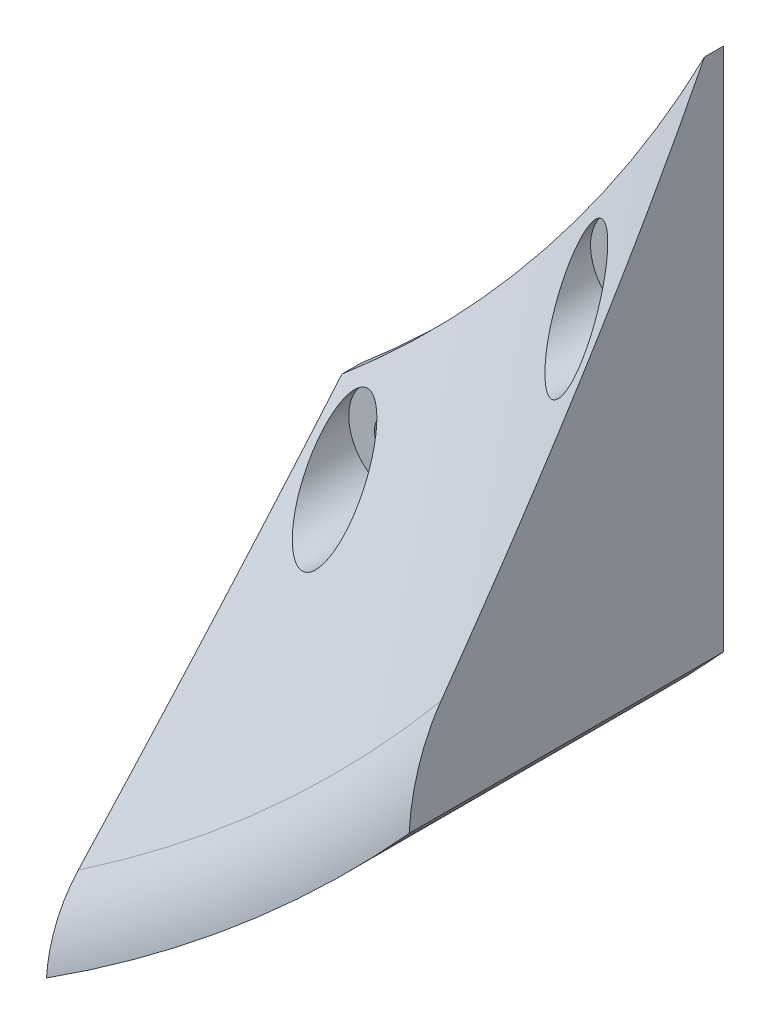
ISO-10303-21;
HEADER;
FILE_DESCRIPTION(('STEP AP214'),'2;1');
FILE_NAME('part.step','',(''),(''),'','','');
FILE_SCHEMA(('AUTOMOTIVE_DESIGN { 1 0 10303 214 1 1 1 1 }'));
ENDSEC;
DATA;
#1=APPLICATION_CONTEXT('core data for automotive mechanical design processes');
#2=APPLICATION_PROTOCOL_DEFINITION('international standard','automotive_design',2000,#1);
#3=PRODUCT_CONTEXT('',#1,'mechanical');
#4=PRODUCT('Part','Part','',(#3));
#5=PRODUCT_RELATED_PRODUCT_CATEGORY('part','',(#4));
#6=PRODUCT_DEFINITION_FORMATION('','',#4);
#7=PRODUCT_DEFINITION_CONTEXT('part definition',#1,'design');
#8=PRODUCT_DEFINITION('design','',#6,#7);
#9=PRODUCT_DEFINITION_SHAPE('','',#8);
#10=(LENGTH_UNIT() NAMED_UNIT(*) SI_UNIT(.MILLI.,.METRE.));
#11=(NAMED_UNIT(*) PLANE_ANGLE_UNIT() SI_UNIT($,.RADIAN.));
#12=(NAMED_UNIT(*) SI_UNIT($,.STERADIAN.) SOLID_ANGLE_UNIT());
#13=UNCERTAINTY_MEASURE_WITH_UNIT(LENGTH_MEASURE(1.E-05),#10,'distance_accuracy_value','');
#14=(GEOMETRIC_REPRESENTATION_CONTEXT(3) GLOBAL_UNCERTAINTY_ASSIGNED_CONTEXT((#13)) GLOBAL_UNIT_ASSIGNED_CONTEXT((#10,
#11,#12)) REPRESENTATION_CONTEXT('',''));
#15=CARTESIAN_POINT('',(0.,0.,0.));
#16=DIRECTION('',(0.,0.,1.));
#17=DIRECTION('',(1.,0.,0.));
#18=AXIS2_PLACEMENT_3D('',#15,#16,#17);
#19=CARTESIAN_POINT('',(0.,0.,3.175));
#20=DIRECTION('',(0.,0.,1.));
#21=DIRECTION('',(1.,0.,0.));
#22=AXIS2_PLACEMENT_3D('',#19,#20,#21);
#23=PLANE('',#22);
#24=CARTESIAN_POINT('',(-205.731089426,0.,3.175));
#25=DIRECTION('',(0.,0.,-1.));
#26=DIRECTION('',(-1.,0.,0.));
#27=AXIS2_PLACEMENT_3D('',#24,#25,#26);
#28=CIRCLE('',#27,190.5);
#29=CARTESIAN_POINT('',(-64.765544713,-128.136510034288,3.175));
#30=VERTEX_POINT('',#29);
#31=CARTESIAN_POINT('',(-102.865544713,-160.340044003043,3.175));
#32=VERTEX_POINT('',#31);
#33=EDGE_CURVE('E175',#30,#32,#28,.T.);
#34=ORIENTED_EDGE('',*,*,#33,.T.);
#35=DIRECTION('',(0.,1.,0.));
#36=VECTOR('',#35,1.);
#37=CARTESIAN_POINT('',(-102.865544713,0.,3.175));
#38=LINE('',#37,#36);
#39=CARTESIAN_POINT('',(-102.865544713,-120.914193587427,3.175));
#40=VERTEX_POINT('',#39);
#41=EDGE_CURVE('E210',#32,#40,#38,.T.);
#42=ORIENTED_EDGE('',*,*,#41,.T.);
#43=CARTESIAN_POINT('',(-205.731089426,0.,3.175));
#44=DIRECTION('',(0.,0.,-1.));
#45=DIRECTION('',(-1.,0.,0.));
#46=AXIS2_PLACEMENT_3D('',#43,#44,#45);
#47=CIRCLE('',#46,158.75);
#48=CARTESIAN_POINT('',(-64.765544713,-73.0087508711607,3.175));
#49=VERTEX_POINT('',#48);
#50=EDGE_CURVE('E116',#49,#40,#47,.T.);
#51=ORIENTED_EDGE('',*,*,#50,.F.);
#52=DIRECTION('',(0.,-1.,0.));
#53=VECTOR('',#52,1.);
#54=CARTESIAN_POINT('',(-64.765544713,0.,3.175));
#55=LINE('',#54,#53);
#56=EDGE_CURVE('E186',#49,#30,#55,.T.);
#57=ORIENTED_EDGE('',*,*,#56,.T.);
#58=EDGE_LOOP('',(#34,#42,#51,#57));
#59=FACE_BOUND('',#58,.T.);
#60=CARTESIAN_POINT('',(-96.5155447130001,-123.814275400871,3.175));
#61=DIRECTION('',(0.,0.,-1.));
#62=DIRECTION('',(-1.,0.,0.));
#63=AXIS2_PLACEMENT_3D('',#60,#61,#62);
#64=CIRCLE('',#63,2.38125);
#65=CARTESIAN_POINT('',(-98.8967947130001,-123.814275400871,3.175));
#66=VERTEX_POINT('',#65);
#67=EDGE_CURVE('E179',#66,#66,#64,.F.);
#68=ORIENTED_EDGE('',*,*,#67,.T.);
#69=EDGE_LOOP('',(#68));
#70=FACE_BOUND('',#69,.T.);
#71=CARTESIAN_POINT('',(-71.115544713,-95.5859044086643,3.175));
#72=DIRECTION('',(0.,0.,-1.));
#73=DIRECTION('',(-1.,0.,0.));
#74=AXIS2_PLACEMENT_3D('',#71,#72,#73);
#75=CIRCLE('',#74,2.38125);
#76=CARTESIAN_POINT('',(-73.4967947130001,-95.5859044086643,3.175));
#77=VERTEX_POINT('',#76);
#78=EDGE_CURVE('E182',#77,#77,#75,.F.);
#79=ORIENTED_EDGE('',*,*,#78,.T.);
#80=EDGE_LOOP('',(#79));
#81=FACE_BOUND('',#80,.T.);
#82=ADVANCED_FACE('F51',(#59,#70,#81),#23,.F.);
#83=CARTESIAN_POINT('',(-64.765544713,0.,3.175));
#84=DIRECTION('',(-1.,0.,0.));
#85=DIRECTION('',(0.,0.,-1.));
#86=AXIS2_PLACEMENT_3D('',#83,#84,#85);
#87=PLANE('',#86);
#88=DIRECTION('',(0.,0.,-1.));
#89=VECTOR('',#88,1.);
#90=CARTESIAN_POINT('',(-64.765544713,-128.136510034288,36.195));
#91=LINE('',#90,#89);
#92=CARTESIAN_POINT('',(-64.765544713,-128.136510034288,36.195));
#93=VERTEX_POINT('',#92);
#94=EDGE_CURVE('E202',#93,#30,#91,.T.);
#95=ORIENTED_EDGE('',*,*,#94,.T.);
#96=ORIENTED_EDGE('',*,*,#56,.F.);
#97=DIRECTION('',(0.,0.,-1.));
#98=VECTOR('',#97,1.);
#99=CARTESIAN_POINT('',(-64.765544713,-73.0087508711607,36.195));
#100=LINE('',#99,#98);
#101=CARTESIAN_POINT('',(-64.765544713,-73.0087508711607,5.16448633567178));
#102=VERTEX_POINT('',#101);
#103=EDGE_CURVE('E191',#102,#49,#100,.T.);
#104=ORIENTED_EDGE('',*,*,#103,.F.);
#105=CARTESIAN_POINT('',(-64.765544713,-122.400454671408,36.195));
#106=CARTESIAN_POINT('',(-64.765544713,-121.416590849687,35.4785968685116));
#107=CARTESIAN_POINT('',(-64.765544713,-120.430388900259,34.76540874244));
#108=CARTESIAN_POINT('',(-64.765544713,-118.453117212918,33.3457993893004));
#109=CARTESIAN_POINT('',(-64.765544713,-117.462047442748,32.6393782071672));
#110=CARTESIAN_POINT('',(-64.765544713,-114.48118501242,30.5307253962073));
#111=CARTESIAN_POINT('',(-64.765544713,-112.483822098221,29.1391649220652));
#112=CARTESIAN_POINT('',(-64.765544713,-108.47048503121,26.3897295277692));
#113=CARTESIAN_POINT('',(-64.765544713,-106.454543729004,25.031806684119));
#114=CARTESIAN_POINT('',(-64.765544713,-102.399473321646,22.3509979809147));
#115=CARTESIAN_POINT('',(-64.765544713,-100.36034425642,21.0281120610459));
#116=CARTESIAN_POINT('',(-64.765544713,-96.2563588364718,18.4208440314967));
#117=CARTESIAN_POINT('',(-64.765544713,-94.1914918681593,17.1364786038629));
#118=CARTESIAN_POINT('',(-64.765544713,-90.0352609181289,14.6114798516549));
#119=CARTESIAN_POINT('',(-64.765544713,-87.9438978934333,13.3708449536465));
#120=CARTESIAN_POINT('',(-64.765544713,-83.7297219329408,10.9366392217588));
#121=CARTESIAN_POINT('',(-64.765544713,-81.6068668523711,9.7431411216564));
#122=CARTESIAN_POINT('',(-64.765544713,-78.3999695866644,7.99408029022117));
#123=CARTESIAN_POINT('',(-64.765544713,-77.3271526736967,7.41788235005025));
#124=CARTESIAN_POINT('',(-64.765544713,-75.1737936033442,6.280052268688));
#125=CARTESIAN_POINT('',(-64.765544713,-74.0932512736997,5.71842045358934));
#126=CARTESIAN_POINT('',(-64.765544713,-73.0087508711607,5.16448633567178));
#127=B_SPLINE_CURVE_WITH_KNOTS('',3,(#105,#106,#107,#108,#109,#110,#111,#112,#113,#114,#115,
#116,#117,#118,#119,#120,#121,#122,#123,#124,#125,#126),.UNSPECIFIED.,.F.,.F.,(4,2,2,2,2,2,2,2,
2,2,4),(0.,3.65115060245099,7.3023254330328,14.6049827275261,21.8965557206125,29.1881161606817,
36.4827900453566,43.7772011975581,51.0824600388428,54.7356424704663,58.3889066156202),.UNSPECIFIED.);
#128=CARTESIAN_POINT('',(-64.765544713,-117.769882618231,32.8601815378473));
#129=VERTEX_POINT('',#128);
#130=EDGE_CURVE('E113',#129,#102,#127,.T.);
#131=ORIENTED_EDGE('',*,*,#130,.F.);
#132=CARTESIAN_POINT('',(-64.765544713,-128.136510034288,36.195));
#133=CARTESIAN_POINT('',(-64.765544713,-127.823580349849,36.1796656996604));
#134=CARTESIAN_POINT('',(-64.765544713,-127.510971987033,36.1578071405204));
#135=CARTESIAN_POINT('',(-64.765544713,-126.886924794625,36.1010465623842));
#136=CARTESIAN_POINT('',(-64.765544713,-126.575486029674,36.0661438328688));
#137=CARTESIAN_POINT('',(-64.765544713,-125.9537996422,35.9832296915999));
#138=CARTESIAN_POINT('',(-64.765544713,-125.643555028566,35.9351956141636));
#139=CARTESIAN_POINT('',(-64.765544713,-125.025416067989,35.8259748325979));
#140=CARTESIAN_POINT('',(-64.765544713,-124.717521692796,35.7647882868191));
#141=CARTESIAN_POINT('',(-64.765544713,-123.814718625966,35.5649447435988));
#142=CARTESIAN_POINT('',(-64.765544713,-123.223773655474,35.4077496997964));
#143=CARTESIAN_POINT('',(-64.765544713,-122.05879493956,35.0414120669158));
#144=CARTESIAN_POINT('',(-64.765544713,-121.48474633384,34.8323167498205));
#145=CARTESIAN_POINT('',(-64.765544713,-120.371871269923,34.3641787371624));
#146=CARTESIAN_POINT('',(-64.765544713,-119.832547293404,34.1063388877265));
#147=CARTESIAN_POINT('',(-64.765544713,-119.043408380623,33.6752720243169));
#148=CARTESIAN_POINT('',(-64.765544713,-118.782022278019,33.5230508447224));
#149=CARTESIAN_POINT('',(-64.765544713,-118.268546544607,33.2032771525242));
#150=CARTESIAN_POINT('',(-64.765544713,-118.016464041156,33.0357132146166));
#151=CARTESIAN_POINT('',(-64.765544713,-117.769882618231,32.8601815378478));
#152=B_SPLINE_CURVE_WITH_KNOTS('',3,(#132,#133,#134,#135,#136,#137,#138,#139,#140,#141,#142,
#143,#144,#145,#146,#147,#148,#149,#150,#151),.UNSPECIFIED.,.F.,.F.,(4,2,2,2,2,2,2,2,2,4),(0.,
0.939843409882723,1.87973802073256,2.82126531601604,3.76278127629976,5.59477906008722,
7.42511430144152,9.21509548376389,10.1220648596623,11.0297152089648),.UNSPECIFIED.);
#153=EDGE_CURVE('E110',#93,#129,#152,.T.);
#154=ORIENTED_EDGE('',*,*,#153,.F.);
#155=EDGE_LOOP('',(#95,#96,#104,#131,#154));
#156=FACE_BOUND('',#155,.T.);
#157=ADVANCED_FACE('F136',(#156),#87,.F.);
#158=CARTESIAN_POINT('',(-71.115544713,-95.5859044086643,0.));
#159=DIRECTION('',(0.,0.,1.));
#160=DIRECTION('',(-1.,0.,0.));
#161=AXIS2_PLACEMENT_3D('',#158,#159,#160);
#162=CYLINDRICAL_SURFACE('',#161,2.38125);
#163=CARTESIAN_POINT('',(-71.115544713,-95.5859044086643,5.715));
#164=DIRECTION('',(0.,0.,1.));
#165=DIRECTION('',(1.,0.,0.));
#166=AXIS2_PLACEMENT_3D('',#163,#164,#165);
#167=CIRCLE('',#166,2.38125);
#168=CARTESIAN_POINT('',(-68.7342947130001,-95.5859044086643,5.715));
#169=VERTEX_POINT('',#168);
#170=EDGE_CURVE('E150',#169,#169,#167,.F.);
#171=ORIENTED_EDGE('',*,*,#170,.F.);
#172=EDGE_LOOP('',(#171));
#173=FACE_BOUND('',#172,.T.);
#174=ORIENTED_EDGE('',*,*,#78,.F.);
#175=EDGE_LOOP('',(#174));
#176=FACE_BOUND('',#175,.T.);
#177=ADVANCED_FACE('F134',(#173,#176),#162,.F.);
#178=CARTESIAN_POINT('',(-96.5155447130001,-123.814275400871,0.));
#179=DIRECTION('',(0.,0.,1.));
#180=DIRECTION('',(-1.,0.,0.));
#181=AXIS2_PLACEMENT_3D('',#178,#179,#180);
#182=CYLINDRICAL_SURFACE('',#181,2.38125);
#183=CARTESIAN_POINT('',(-96.5155447130001,-123.814275400871,5.715));
#184=DIRECTION('',(0.,0.,1.));
#185=DIRECTION('',(1.,0.,0.));
#186=AXIS2_PLACEMENT_3D('',#183,#184,#185);
#187=CIRCLE('',#186,2.38125);
#188=CARTESIAN_POINT('',(-94.1342947130001,-123.814275400871,5.715));
#189=VERTEX_POINT('',#188);
#190=EDGE_CURVE('E198',#189,#189,#187,.F.);
#191=ORIENTED_EDGE('',*,*,#190,.F.);
#192=EDGE_LOOP('',(#191));
#193=FACE_BOUND('',#192,.T.);
#194=ORIENTED_EDGE('',*,*,#67,.F.);
#195=EDGE_LOOP('',(#194));
#196=FACE_BOUND('',#195,.T.);
#197=ADVANCED_FACE('F220',(#193,#196),#182,.F.);
#198=CARTESIAN_POINT('',(-205.731089426,0.,36.195));
#199=DIRECTION('',(0.,0.,-1.));
#200=DIRECTION('',(1.,0.,0.));
#201=AXIS2_PLACEMENT_3D('',#198,#199,#200);
#202=CYLINDRICAL_SURFACE('',#201,190.5);
#203=ORIENTED_EDGE('',*,*,#33,.F.);
#204=ORIENTED_EDGE('',*,*,#94,.F.);
#205=CARTESIAN_POINT('',(-205.731089426,0.,36.195));
#206=DIRECTION('',(0.,0.,-1.));
#207=DIRECTION('',(-1.,0.,0.));
#208=AXIS2_PLACEMENT_3D('',#205,#206,#207);
#209=CIRCLE('',#208,190.5);
#210=CARTESIAN_POINT('',(-102.865544713,-160.340044003043,36.195));
#211=VERTEX_POINT('',#210);
#212=EDGE_CURVE('E189',#93,#211,#209,.T.);
#213=ORIENTED_EDGE('',*,*,#212,.T.);
#214=DIRECTION('',(0.,0.,-1.));
#215=VECTOR('',#214,1.);
#216=CARTESIAN_POINT('',(-102.865544713,-160.340044003043,36.195));
#217=LINE('',#216,#215);
#218=EDGE_CURVE('E105',#211,#32,#217,.T.);
#219=ORIENTED_EDGE('',*,*,#218,.T.);
#220=EDGE_LOOP('',(#203,#204,#213,#219));
#221=FACE_BOUND('',#220,.T.);
#222=ADVANCED_FACE('F142',(#221),#202,.T.);
#223=CARTESIAN_POINT('',(-205.731089426,0.,36.195));
#224=DIRECTION('',(0.,0.,-1.));
#225=DIRECTION('',(1.,0.,0.));
#226=AXIS2_PLACEMENT_3D('',#223,#224,#225);
#227=CYLINDRICAL_SURFACE('',#226,158.75);
#228=ORIENTED_EDGE('',*,*,#103,.T.);
#229=ORIENTED_EDGE('',*,*,#50,.T.);
#230=DIRECTION('',(0.,0.,-1.));
#231=VECTOR('',#230,1.);
#232=CARTESIAN_POINT('',(-102.865544713,-120.914193587427,36.195));
#233=LINE('',#232,#231);
#234=CARTESIAN_POINT('',(-102.865544713,-120.914193587427,5.16448633567178));
#235=VERTEX_POINT('',#234);
#236=EDGE_CURVE('E201',#235,#40,#233,.T.);
#237=ORIENTED_EDGE('',*,*,#236,.F.);
#238=CARTESIAN_POINT('',(-205.731089426,0.,5.16448633567178));
#239=DIRECTION('',(0.,0.,-1.));
#240=DIRECTION('',(-1.,0.,0.));
#241=AXIS2_PLACEMENT_3D('',#238,#239,#240);
#242=CIRCLE('',#241,158.75);
#243=EDGE_CURVE('E77',#102,#235,#242,.T.);
#244=ORIENTED_EDGE('',*,*,#243,.F.);
#245=EDGE_LOOP('',(#228,#229,#237,#244));
#246=FACE_BOUND('',#245,.T.);
#247=ADVANCED_FACE('F214',(#246),#227,.F.);
#248=CARTESIAN_POINT('',(-205.731089426,0.,5.16448633567178));
#249=DIRECTION('',(0.,0.,1.));
#250=DIRECTION('',(-1.,0.,0.));
#251=AXIS2_PLACEMENT_3D('',#248,#249,#250);
#252=CONICAL_SURFACE('',#251,158.75,0.733038285837613);
#253=CARTESIAN_POINT('',(-92.5905024590012,-127.039247230876,17.7887178190615));
#254=CARTESIAN_POINT('',(-92.6546991101273,-127.11738039782,17.8061015104382));
#255=CARTESIAN_POINT('',(-92.7215713357747,-127.194005570302,17.8203561981865));
#256=CARTESIAN_POINT('',(-92.8603306129642,-127.343612167539,17.8423442933654));
#257=CARTESIAN_POINT('',(-92.9322189260877,-127.416592667658,17.8500760537861));
#258=CARTESIAN_POINT('',(-93.0805265969551,-127.558280265856,17.8588567655701));
#259=CARTESIAN_POINT('',(-93.1569475779661,-127.626985814693,17.859903308018));
#260=CARTESIAN_POINT('',(-93.3137284336997,-127.759565749781,17.8552852893378));
#261=CARTESIAN_POINT('',(-93.3940898261815,-127.823438249972,17.8496181224601));
#262=CARTESIAN_POINT('',(-93.5578458627742,-127.945720016927,17.831705659719));
#263=CARTESIAN_POINT('',(-93.6412324454473,-128.004142506699,17.8194767985287));
#264=CARTESIAN_POINT('',(-93.8105599902199,-128.115406180831,17.7886831431106));
#265=CARTESIAN_POINT('',(-93.8965019316025,-128.168245189183,17.770115890508));
#266=CARTESIAN_POINT('',(-94.0702250179814,-128.268133534975,17.7269815073936));
#267=CARTESIAN_POINT('',(-94.1580063002118,-128.315182438599,17.7024139277266));
#268=CARTESIAN_POINT('',(-94.3347631781989,-128.403431732317,17.6476845160489));
#269=CARTESIAN_POINT('',(-94.423739016458,-128.444630914614,17.6175215317062));
#270=CARTESIAN_POINT('',(-94.6241615960391,-128.530596831443,17.5440259651274));
#271=CARTESIAN_POINT('',(-94.7357766834628,-128.573767585892,17.4992770794999));
#272=CARTESIAN_POINT('',(-94.9589587285058,-128.651362913875,17.4026941886754));
#273=CARTESIAN_POINT('',(-95.0705256695897,-128.685785512373,17.3508585875962));
#274=CARTESIAN_POINT('',(-95.4041727879466,-128.776571152282,17.1859166525368));
#275=CARTESIAN_POINT('',(-95.6250836517558,-128.820403901592,17.0634187224647));
#276=CARTESIAN_POINT('',(-96.1432524221904,-128.889730781329,16.7485647750944));
#277=CARTESIAN_POINT('',(-96.4369844409825,-128.901570484311,16.5475165368222));
#278=CARTESIAN_POINT('',(-96.8621159628695,-128.884429292071,16.2280782326074));
#279=CARTESIAN_POINT('',(-97.0014188764536,-128.872861111811,16.1184677221754));
#280=CARTESIAN_POINT('',(-97.2746672442942,-128.839120813814,15.8942485653298));
#281=CARTESIAN_POINT('',(-97.4086126570525,-128.816948613957,15.7796398802156));
#282=CARTESIAN_POINT('',(-97.7285387468165,-128.751098223893,15.4950973422487));
#283=CARTESIAN_POINT('',(-97.9115181592436,-128.702251005113,15.3229844231208));
#284=CARTESIAN_POINT('',(-98.2655515235218,-128.586962725597,14.972462926533));
#285=CARTESIAN_POINT('',(-98.4366002992775,-128.520514087749,14.7940516664811));
#286=CARTESIAN_POINT('',(-98.766647032044,-128.371874926291,14.4324976689105));
#287=CARTESIAN_POINT('',(-98.9256365689958,-128.28967354241,14.2493517430152));
#288=CARTESIAN_POINT('',(-99.2312677303565,-128.111084614674,13.8797893209877));
#289=CARTESIAN_POINT('',(-99.377910859543,-128.01469880356,13.6933732267792));
#290=CARTESIAN_POINT('',(-99.6632109976912,-127.80562478509,13.3123117388358));
#291=CARTESIAN_POINT('',(-99.8014603135013,-127.692512450487,13.1175943203596));
#292=CARTESIAN_POINT('',(-100.064372259409,-127.453477151525,12.7268510746179));
#293=CARTESIAN_POINT('',(-100.189034104341,-127.327553447662,12.5308251724343));
#294=CARTESIAN_POINT('',(-100.424378658634,-127.063687115915,12.1384026626774));
#295=CARTESIAN_POINT('',(-100.535058555305,-126.925742079152,11.9420059885568));
#296=CARTESIAN_POINT('',(-100.741829460377,-126.638497866944,11.5498456510513));
#297=CARTESIAN_POINT('',(-100.837921078415,-126.489199166354,11.354081961549));
#298=CARTESIAN_POINT('',(-101.015443960921,-126.178503852977,10.9626265988547));
#299=CARTESIAN_POINT('',(-101.09675184416,-126.017020042858,10.766948020491));
#300=CARTESIAN_POINT('',(-101.242692369705,-125.683401476994,10.3783770230577));
#301=CARTESIAN_POINT('',(-101.307322333511,-125.511265015915,10.1854850562121));
#302=CARTESIAN_POINT('',(-101.418414447519,-125.15692600972,9.80412135998444));
#303=CARTESIAN_POINT('',(-101.464896235757,-124.974734590134,9.6156450612681));
#304=CARTESIAN_POINT('',(-101.537942126659,-124.60056302436,9.24469893467823));
#305=CARTESIAN_POINT('',(-101.564516038589,-124.40858774887,9.06222619108833));
#306=CARTESIAN_POINT('',(-101.589869043688,-124.085687081535,8.76933618015193));
#307=CARTESIAN_POINT('',(-101.595188860949,-123.957475363168,8.65648281768621));
#308=CARTESIAN_POINT('',(-101.595866326057,-123.697452302531,8.4349806756223));
#309=CARTESIAN_POINT('',(-101.591222371961,-123.565640384798,8.326332574991));
#310=CARTESIAN_POINT('',(-101.56103863633,-123.16552045803,8.00832029168472));
#311=CARTESIAN_POINT('',(-101.51929586151,-122.891996178434,7.80639996191763));
#312=CARTESIAN_POINT('',(-101.401170654182,-122.406111854473,7.48032423245789));
#313=CARTESIAN_POINT('',(-101.336081643918,-122.195589541588,7.3493579295817));
#314=CARTESIAN_POINT('',(-101.173150673152,-121.773670652553,7.11117175586325));
#315=CARTESIAN_POINT('',(-101.075356447075,-121.562275791478,7.003917653008));
#316=CARTESIAN_POINT('',(-100.867499794618,-121.18689499686,6.83921220646396));
#317=CARTESIAN_POINT('',(-100.763843404469,-121.021912530993,6.77608509386644));
#318=CARTESIAN_POINT('',(-100.591608257068,-120.780811235291,6.69951983513149));
#319=CARTESIAN_POINT('',(-100.53139248416,-120.70149255677,6.67701657571878));
#320=CARTESIAN_POINT('',(-100.405575996674,-120.545626087158,6.63846379467833));
#321=CARTESIAN_POINT('',(-100.339977524941,-120.469077160943,6.62241160131989));
#322=CARTESIAN_POINT('',(-100.203343962757,-120.31900802809,6.5970270345276));
#323=CARTESIAN_POINT('',(-100.132280445798,-120.245507214774,6.58773285214589));
#324=CARTESIAN_POINT('',(-99.9855704869944,-120.102699409142,6.57622160369491));
#325=CARTESIAN_POINT('',(-99.9099259340515,-120.033390711533,6.57400164068306));
#326=CARTESIAN_POINT('',(-99.7546295570817,-119.899529644222,6.57668667954216));
#327=CARTESIAN_POINT('',(-99.6749770119214,-119.834978135638,6.58159296805273));
#328=CARTESIAN_POINT('',(-99.5124153273696,-119.711151343348,6.59840643227031));
#329=CARTESIAN_POINT('',(-99.4295062888111,-119.65187589646,6.61031339137009));
#330=CARTESIAN_POINT('',(-99.1900900102532,-119.491311282885,6.65380248953158));
#331=CARTESIAN_POINT('',(-99.0304514357901,-119.39672221954,6.69350918055355));
#332=CARTESIAN_POINT('',(-98.7071287047489,-119.227688131059,6.79323937307681));
#333=CARTESIAN_POINT('',(-98.5434429741457,-119.153251082363,6.85327089832455));
#334=CARTESIAN_POINT('',(-98.149894251811,-118.998038809066,7.01788342203895));
#335=CARTESIAN_POINT('',(-97.9197628447823,-118.926648732332,7.13067847838025));
#336=CARTESIAN_POINT('',(-97.4650222019311,-118.818293516656,7.38130155358936));
#337=CARTESIAN_POINT('',(-97.2404260235178,-118.781403366094,7.51918332758338));
#338=CARTESIAN_POINT('',(-96.8622111463312,-118.743622083132,7.77185521356254));
#339=CARTESIAN_POINT('',(-96.7063079143692,-118.735548795046,7.88232001342649));
#340=CARTESIAN_POINT('',(-96.3999345147302,-118.733279961618,8.11077579873637));
#341=CARTESIAN_POINT('',(-96.2494666984454,-118.739090351146,8.22876998179223));
#342=CARTESIAN_POINT('',(-95.9542563955479,-118.763204232285,8.47084556459911));
#343=CARTESIAN_POINT('',(-95.8095221908607,-118.781525145087,8.59493522853087));
#344=CARTESIAN_POINT('',(-95.5262245565947,-118.82947040586,8.84782312489465));
#345=CARTESIAN_POINT('',(-95.387661041246,-118.859094596666,8.97662129183519));
#346=CARTESIAN_POINT('',(-95.0566803401067,-118.944070825663,9.29597839132338));
#347=CARTESIAN_POINT('',(-94.8676524449812,-119.005006162067,9.48858016123774));
#348=CARTESIAN_POINT('',(-94.5028556603964,-119.145900185466,9.87933709386759));
#349=CARTESIAN_POINT('',(-94.3270925105454,-119.225867045877,10.0774946102485));
#350=CARTESIAN_POINT('',(-93.9889181616239,-119.403037520644,10.4777417892231));
#351=CARTESIAN_POINT('',(-93.8265182012388,-119.500255430895,10.6798345883567));
#352=CARTESIAN_POINT('',(-93.5155140374158,-119.710443606866,11.0863440868811));
#353=CARTESIAN_POINT('',(-93.3669079923423,-119.823411764705,11.2907604719459));
#354=CARTESIAN_POINT('',(-93.0800389689962,-120.067265108108,11.7062546234733));
#355=CARTESIAN_POINT('',(-92.9421617116517,-120.198550490753,11.9173636729047));
#356=CARTESIAN_POINT('',(-92.6819318376433,-120.475720184138,12.3396047955641));
#357=CARTESIAN_POINT('',(-92.5595808201344,-120.621605995914,12.5507368689258));
#358=CARTESIAN_POINT('',(-92.3313301436734,-120.927216636812,12.9717180739997));
#359=CARTESIAN_POINT('',(-92.2254233623952,-121.086935427637,13.1815677231094));
#360=CARTESIAN_POINT('',(-92.0311731421303,-121.419713972098,13.5987772615913));
#361=CARTESIAN_POINT('',(-91.9428261271454,-121.592770999455,13.806137649796));
#362=CARTESIAN_POINT('',(-91.799408801205,-121.919467197334,14.1799465013823));
#363=CARTESIAN_POINT('',(-91.7412112057066,-122.070996825346,14.3470424368463));
#364=CARTESIAN_POINT('',(-91.6387298654417,-122.382505089657,14.677646188619));
#365=CARTESIAN_POINT('',(-91.5944467740194,-122.542484122278,14.8411538361074));
#366=CARTESIAN_POINT('',(-91.5211782095911,-122.870403137607,15.1632102240033));
#367=CARTESIAN_POINT('',(-91.4921746977692,-123.038333476587,15.3217646030864));
#368=CARTESIAN_POINT('',(-91.4510313230046,-123.381826491086,15.6325568970638));
#369=CARTESIAN_POINT('',(-91.4388848263436,-123.55738613619,15.7847972738048));
#370=CARTESIAN_POINT('',(-91.432366041222,-123.982789189361,16.1367653824529));
#371=CARTESIAN_POINT('',(-91.4463522726643,-124.235832712287,16.3329290182894));
#372=CARTESIAN_POINT('',(-91.5161113002225,-124.752267148071,16.7031256956984));
#373=CARTESIAN_POINT('',(-91.5718343856732,-125.015645398404,16.8771847766807));
#374=CARTESIAN_POINT('',(-91.7120240303493,-125.480311259046,17.1539320868535));
#375=CARTESIAN_POINT('',(-91.7857704271134,-125.680596781037,17.2635699303579));
#376=CARTESIAN_POINT('',(-91.9187020799021,-125.979294581189,17.4105646494451));
#377=CARTESIAN_POINT('',(-91.9666825620732,-126.078490995751,17.4566217382473));
#378=CARTESIAN_POINT('',(-92.0702811802778,-126.275660635477,17.5422624015761));
#379=CARTESIAN_POINT('',(-92.1258958940165,-126.373634387389,17.5818488594525));
#380=CARTESIAN_POINT('',(-92.2451661501229,-126.568062953143,17.6540339023377));
#381=CARTESIAN_POINT('',(-92.3088639639465,-126.6645065436,17.6865931269762));
#382=CARTESIAN_POINT('',(-92.4439856563832,-126.854404664638,17.7437707368517));
#383=CARTESIAN_POINT('',(-92.5154138054698,-126.947857505725,17.7683847026763));
#384=CARTESIAN_POINT('',(-92.5905024590012,-127.039247230876,17.7887178190615));
#385=B_SPLINE_CURVE_WITH_KNOTS('',3,(#253,#254,#255,#256,#257,#258,#259,#260,#261,#262,#263,
#264,#265,#266,#267,#268,#269,#270,#271,#272,#273,#274,#275,#276,#277,#278,#279,#280,#281,#282,
#283,#284,#285,#286,#287,#288,#289,#290,#291,#292,#293,#294,#295,#296,#297,#298,#299,#300,#301,
#302,#303,#304,#305,#306,#307,#308,#309,#310,#311,#312,#313,#314,#315,#316,#317,#318,#319,#320,
#321,#322,#323,#324,#325,#326,#327,#328,#329,#330,#331,#332,#333,#334,#335,#336,#337,#338,#339,
#340,#341,#342,#343,#344,#345,#346,#347,#348,#349,#350,#351,#352,#353,#354,#355,#356,#357,#358,
#359,#360,#361,#362,#363,#364,#365,#366,#367,#368,#369,#370,#371,#372,#373,#374,#375,#376,#377,
#378,#379,#380,#381,#382,#383,#384),.UNSPECIFIED.,.T.,.F.,(4,2,2,2,2,2,2,2,2,2,2,2,2,2,2,2,2,2,
2,2,2,2,2,2,2,2,2,2,2,2,2,2,2,2,2,2,2,2,2,2,2,2,2,2,2,2,2,2,2,2,2,2,2,2,2,2,2,2,2,2,2,2,2,2,2,
4),(0.,0.30771368946044,0.615505052006561,0.923407316179262,1.23142912367335,1.53868302460266,
1.84605623104651,2.15345245300306,2.46091205135506,2.84364464431748,3.22646356858191,
3.99249399373615,5.05486964695786,5.58743721513727,6.12000890769639,6.88662829923126,
7.65357824530168,8.42105885728049,9.18844579307419,9.98047626261446,10.7725524761356,
11.5647877753237,12.3569899582535,13.155527241698,13.9541926916836,14.7519914990772,
15.5493969457114,16.0616947222102,16.57407487039,17.5966811956328,18.3631832045696,
19.1285713238863,19.7402775898132,20.0462404365667,20.3520764368696,20.6596276304391,
20.9670528634369,21.2745336087412,21.5820048408076,22.1486405159965,22.7155001463992,
23.5092153523691,24.3046517800034,24.8776448191043,25.450882840002,26.0249207402982,
26.5989506592242,27.427720905371,28.2568477255513,29.086664877213,29.9163710795461,
30.7683945512818,31.6205057077064,32.4722467620919,33.323814183628,34.0221449728915,
34.7205085468164,35.4180457862403,36.1153084468702,37.0736578231811,38.0308675693009,
38.7479030674051,39.1058308701501,39.4635987408392,39.8233212993231,40.1832436038275),.UNSPECIFIED.);
#386=CARTESIAN_POINT('',(-92.5905024590012,-127.039247230876,17.7887178190615));
#387=VERTEX_POINT('',#386);
#388=EDGE_CURVE('E247',#387,#387,#385,.T.);
#389=ORIENTED_EDGE('',*,*,#388,.T.);
#390=EDGE_LOOP('',(#389));
#391=FACE_BOUND('',#390,.T.);
#392=CARTESIAN_POINT('',(-71.0410309036524,-100.66535789228,15.6059072257644));
#393=CARTESIAN_POINT('',(-71.2379135786857,-100.668246167388,15.4326797190692));
#394=CARTESIAN_POINT('',(-71.4311638540465,-100.659653517566,15.2551915531096));
#395=CARTESIAN_POINT('',(-71.8096302683157,-100.621858383365,14.893802764287));
#396=CARTESIAN_POINT('',(-71.9948410101305,-100.592642274436,14.7098979787776));
#397=CARTESIAN_POINT('',(-72.3569635275556,-100.515371436444,14.3369858006296));
#398=CARTESIAN_POINT('',(-72.5338513905199,-100.467265744322,14.1479659030821));
#399=CARTESIAN_POINT('',(-72.8782433257375,-100.353729844209,13.7667185077645));
#400=CARTESIAN_POINT('',(-73.045749171543,-100.288302924061,13.5744916252124));
#401=CARTESIAN_POINT('',(-73.3736120341417,-100.140070488582,13.1847582891658));
#402=CARTESIAN_POINT('',(-73.5338059290992,-100.056996564263,12.9872170200293));
#403=CARTESIAN_POINT('',(-73.8435082576608,-99.8750617193658,12.5910200225897));
#404=CARTESIAN_POINT('',(-73.993015955142,-99.7761997127345,12.3923642185261));
#405=CARTESIAN_POINT('',(-74.2806418905381,-99.5634097203724,11.9950318245066));
#406=CARTESIAN_POINT('',(-74.4187649711326,-99.4494881947726,11.7963552797594));
#407=CARTESIAN_POINT('',(-74.6829150500069,-99.2070106544826,11.3999048208962));
#408=CARTESIAN_POINT('',(-74.8089428435431,-99.0784556031524,11.2021308482522));
#409=CARTESIAN_POINT('',(-75.0447681176526,-98.8105895479875,10.8137769126497));
#410=CARTESIAN_POINT('',(-75.1549078783953,-98.6716551072164,10.6231454304942));
#411=CARTESIAN_POINT('',(-75.3617057707094,-98.3802632626502,10.2448376702434));
#412=CARTESIAN_POINT('',(-75.4583619774746,-98.2278039332198,10.0571618174557));
#413=CARTESIAN_POINT('',(-75.636637728345,-97.9095556668038,9.68634925986457));
#414=CARTESIAN_POINT('',(-75.7182724963359,-97.7437804727339,9.50320812401505));
#415=CARTESIAN_POINT('',(-75.8647565289966,-97.3987745885825,9.14303776442716));
#416=CARTESIAN_POINT('',(-75.9296138940202,-97.2195504459592,8.96600562709709));
#417=CARTESIAN_POINT('',(-76.0205683619558,-96.913607602748,8.6816115631344));
#418=CARTESIAN_POINT('',(-76.0522541534109,-96.7908110649881,8.57180835760005));
#419=CARTESIAN_POINT('',(-76.1068637589688,-96.5396664110092,8.35646434294884));
#420=CARTESIAN_POINT('',(-76.1297861638832,-96.4113174056214,8.25092422179168));
#421=CARTESIAN_POINT('',(-76.1839998283831,-96.0183601293182,7.94231098685604));
#422=CARTESIAN_POINT('',(-76.2008953160572,-95.7453355107561,7.74676759685844));
#423=CARTESIAN_POINT('',(-76.1889168888722,-95.2507256080322,7.43158988077237));
#424=CARTESIAN_POINT('',(-76.1703758911445,-95.033223295291,7.30516885211169));
#425=CARTESIAN_POINT('',(-76.1020917958787,-94.5905793321138,7.0761050125863));
#426=CARTESIAN_POINT('',(-76.0523935495969,-94.3654491020774,6.9734283117932));
#427=CARTESIAN_POINT('',(-75.9311690042794,-93.9573308591555,6.81621369025177));
#428=CARTESIAN_POINT('',(-75.8657626721995,-93.7746566444962,6.75619819669269));
#429=CARTESIAN_POINT('',(-75.7114960903448,-93.4128430873907,6.66036975721741));
#430=CARTESIAN_POINT('',(-75.6226539206126,-93.2337011339219,6.62453822960677));
#431=CARTESIAN_POINT('',(-75.4220920188497,-92.8838956362606,6.57986449303515));
#432=CARTESIAN_POINT('',(-75.3102689117655,-92.7132748917344,6.57114721563321));
#433=CARTESIAN_POINT('',(-75.0673552236447,-92.3873254602811,6.58186168796251));
#434=CARTESIAN_POINT('',(-74.9362638415659,-92.2319974095677,6.60129460828297));
#435=CARTESIAN_POINT('',(-74.6694322158597,-91.9511805848456,6.66427584442706));
#436=CARTESIAN_POINT('',(-74.534649090037,-91.8243679597352,6.70605331569616));
#437=CARTESIAN_POINT('',(-74.2568522156267,-91.5894387944786,6.80963618926421));
#438=CARTESIAN_POINT('',(-74.1138352161533,-91.4813297072428,6.87144954731944));
#439=CARTESIAN_POINT('',(-73.7623920198252,-91.2427935252597,7.04120283418361));
#440=CARTESIAN_POINT('',(-73.5515972958356,-91.1219066590289,7.15762502634609));
#441=CARTESIAN_POINT('',(-73.127915820541,-90.9155095821175,7.4155095129443));
#442=CARTESIAN_POINT('',(-72.9150254577445,-90.8300786921877,7.55702695154486));
#443=CARTESIAN_POINT('',(-72.550750239469,-90.7102066166072,7.81619162245011));
#444=CARTESIAN_POINT('',(-72.3986951124586,-90.6681942725124,7.9295616180108));
#445=CARTESIAN_POINT('',(-72.0968982677556,-90.5991901875735,8.1638106497257));
#446=CARTESIAN_POINT('',(-71.9471575766642,-90.5722049362725,8.28469290508493));
#447=CARTESIAN_POINT('',(-71.6505843497048,-90.5319397533347,8.53251041513967));
#448=CARTESIAN_POINT('',(-71.5037560878902,-90.5186786853048,8.65945375078664));
#449=CARTESIAN_POINT('',(-71.2137063450632,-90.5047784777627,8.91800338115941));
#450=CARTESIAN_POINT('',(-71.0704848077567,-90.5041391411268,9.04960960302898));
#451=CARTESIAN_POINT('',(-70.7261011628177,-90.5167756237041,9.3749732189013));
#452=CARTESIAN_POINT('',(-70.5270259422922,-90.5362665030902,9.57071388233329));
#453=CARTESIAN_POINT('',(-70.1377336046029,-90.5970060307576,9.96758978616285));
#454=CARTESIAN_POINT('',(-69.9475202784221,-90.6382638992831,10.1687272782998));
#455=CARTESIAN_POINT('',(-69.5764543416267,-90.7408369451103,10.5747851440463));
#456=CARTESIAN_POINT('',(-69.3956099163028,-90.8021693296169,10.7797086201835));
#457=CARTESIAN_POINT('',(-69.044083573225,-90.9435630582462,11.19171424688));
#458=CARTESIAN_POINT('',(-68.8734002984606,-91.0236218944011,11.3987961048298));
#459=CARTESIAN_POINT('',(-68.5386199007177,-91.2037923339441,11.8192042042499));
#460=CARTESIAN_POINT('',(-68.3748007408823,-91.3043622099876,12.0325552958696));
#461=CARTESIAN_POINT('',(-68.0593513569875,-91.5235196173652,12.4590597627691));
#462=CARTESIAN_POINT('',(-67.9077225010827,-91.642109166797,12.6722131132096));
#463=CARTESIAN_POINT('',(-67.6178252870519,-91.8967898939577,13.0969408367834));
#464=CARTESIAN_POINT('',(-67.4795495190584,-92.032871266285,13.3085160248131));
#465=CARTESIAN_POINT('',(-67.2176380049244,-92.3223458710214,13.728836234256));
#466=CARTESIAN_POINT('',(-67.0939987781772,-92.4757349705947,13.9375819180347));
#467=CARTESIAN_POINT('',(-66.8870573090933,-92.7661279174131,14.3078078265861));
#468=CARTESIAN_POINT('',(-66.8007090131261,-92.8999254968459,14.4701062885431));
#469=CARTESIAN_POINT('',(-66.6393666971925,-93.178389642163,14.7910363815825));
#470=CARTESIAN_POINT('',(-66.5643730290915,-93.3230565446662,14.9496678989018));
#471=CARTESIAN_POINT('',(-66.4271557680139,-93.6231020956633,15.2619330106031));
#472=CARTESIAN_POINT('',(-66.3649175950916,-93.7784682399922,15.4155721404297));
#473=CARTESIAN_POINT('',(-66.2547682058143,-94.0999349899307,15.7165229732603));
#474=CARTESIAN_POINT('',(-66.2068516050696,-94.2660315326662,15.8638370363759));
#475=CARTESIAN_POINT('',(-66.1118495358724,-94.6753418528806,16.2059783288456));
#476=CARTESIAN_POINT('',(-66.072272153014,-94.9235102920132,16.3971125014413));
#477=CARTESIAN_POINT('',(-66.0311328653116,-95.4386016490539,16.7570100181237));
#478=CARTESIAN_POINT('',(-66.0295161333785,-95.7054969601882,16.9258052759327));
#479=CARTESIAN_POINT('',(-66.0670750915243,-96.1886706472046,17.1953276753999));
#480=CARTESIAN_POINT('',(-66.0966688365952,-96.4019446021468,17.3027044200844));
#481=CARTESIAN_POINT('',(-66.1860854444011,-96.832927055746,17.4934640079334));
#482=CARTESIAN_POINT('',(-66.2458695986113,-97.0506295342204,17.5768773613553));
#483=CARTESIAN_POINT('',(-66.3862341058751,-97.4507918053148,17.7033306781548));
#484=CARTESIAN_POINT('',(-66.462196650607,-97.6335180864824,17.750608920745));
#485=CARTESIAN_POINT('',(-66.6373072156345,-97.9924736259449,17.820716676253));
#486=CARTESIAN_POINT('',(-66.7364419394082,-98.1687065433392,17.8435601684131));
#487=CARTESIAN_POINT('',(-66.956166286119,-98.509456692473,17.8630908109424));
#488=CARTESIAN_POINT('',(-67.0768066811807,-98.673944880441,17.8597152405758));
#489=CARTESIAN_POINT('',(-67.3354943783268,-98.9857101507302,17.8269317158324));
#490=CARTESIAN_POINT('',(-67.4735450169272,-99.1329839236125,17.7975187651058));
#491=CARTESIAN_POINT('',(-67.7576142844871,-99.4026970827267,17.7161632832347));
#492=CARTESIAN_POINT('',(-67.9032490631669,-99.525768754933,17.6649535771923));
#493=CARTESIAN_POINT('',(-68.2019550776282,-99.7515400189147,17.5432086638019));
#494=CARTESIAN_POINT('',(-68.355030398401,-99.8542282588991,17.4726627396435));
#495=CARTESIAN_POINT('',(-68.7351163158094,-100.081309719267,17.2799314300506));
#496=CARTESIAN_POINT('',(-68.9642738804968,-100.194536316522,17.1488174227914));
#497=CARTESIAN_POINT('',(-69.4227957695633,-100.382011347985,16.861649875632));
#498=CARTESIAN_POINT('',(-69.6521597821796,-100.456193124129,16.7055542751569));
#499=CARTESIAN_POINT('',(-70.0776361577666,-100.562950580361,16.3962051769348));
#500=CARTESIAN_POINT('',(-70.2743076357167,-100.599580791348,16.2450556709293));
#501=CARTESIAN_POINT('',(-70.6620960043809,-100.649399689167,15.9325280679671));
#502=CARTESIAN_POINT('',(-70.8532162063485,-100.662602644694,15.7711562591247));
#503=CARTESIAN_POINT('',(-71.0410309036524,-100.66535789228,15.6059072257644));
#504=B_SPLINE_CURVE_WITH_KNOTS('',3,(#392,#393,#394,#395,#396,#397,#398,#399,#400,#401,#402,
#403,#404,#405,#406,#407,#408,#409,#410,#411,#412,#413,#414,#415,#416,#417,#418,#419,#420,#421,
#422,#423,#424,#425,#426,#427,#428,#429,#430,#431,#432,#433,#434,#435,#436,#437,#438,#439,#440,
#441,#442,#443,#444,#445,#446,#447,#448,#449,#450,#451,#452,#453,#454,#455,#456,#457,#458,#459,
#460,#461,#462,#463,#464,#465,#466,#467,#468,#469,#470,#471,#472,#473,#474,#475,#476,#477,#478,
#479,#480,#481,#482,#483,#484,#485,#486,#487,#488,#489,#490,#491,#492,#493,#494,#495,#496,#497,
#498,#499,#500,#501,#502,#503),.UNSPECIFIED.,.T.,.F.,(4,2,2,2,2,2,2,2,2,2,2,2,2,2,2,2,2,2,2,2,2,
2,2,2,2,2,2,2,2,2,2,2,2,2,2,2,2,2,2,2,2,2,2,2,2,2,2,2,2,2,2,2,2,2,2,4),(0.,0.786467299107127,
1.57345465178775,2.36258000490209,3.15155567681244,3.95352221713775,4.75554394810355,
5.55722274291926,6.35884879178391,7.13917463143708,7.91961175053297,8.69925350478193,
9.47851813205237,9.9814060064271,10.4843747132525,11.4881890861446,12.2424869589416,
12.9957014957033,13.6025198797404,14.2088714838726,14.818012804735,15.4271794566708,
15.9939872488977,16.5610203827927,17.3649058595641,18.1705801880458,18.7526284428749,
19.3349278642973,19.9180265855741,20.5011162001196,21.3395011402759,22.17824149604,
23.0177026831215,23.8570515084298,24.7177504171249,25.5785457901929,26.4388607140595,
27.2989706401277,27.9805741314656,28.6621987405105,29.3430398308735,30.0236246268572,
30.9677754522807,31.9105625436929,32.6297924715748,33.3481025738555,33.9558414231355,
34.5632323957251,35.1720768039856,35.7810380695913,36.3709679929215,36.9612255395618,
37.818260044571,38.6767529879369,39.4274547364124,40.1776991024857),.UNSPECIFIED.);
#505=CARTESIAN_POINT('',(-71.0410309036524,-100.66535789228,15.6059072257644));
#506=VERTEX_POINT('',#505);
#507=EDGE_CURVE('E213',#506,#506,#504,.T.);
#508=ORIENTED_EDGE('',*,*,#507,.T.);
#509=EDGE_LOOP('',(#508));
#510=FACE_BOUND('',#509,.T.);
#511=ORIENTED_EDGE('',*,*,#130,.T.);
#512=ORIENTED_EDGE('',*,*,#243,.T.);
#513=CARTESIAN_POINT('',(-102.865544713,-120.914193587427,5.16448633567178));
#514=CARTESIAN_POINT('',(-102.865544713,-122.399563837253,6.42100901924889));
#515=CARTESIAN_POINT('',(-102.865544713,-123.880160902784,7.68316059880523));
#516=CARTESIAN_POINT('',(-102.865544713,-126.832432831344,10.2178324006914));
#517=CARTESIAN_POINT('',(-102.865544713,-128.304107770391,11.4903525344618));
#518=CARTESIAN_POINT('',(-102.865544713,-131.239001679849,14.0447342694597));
#519=CARTESIAN_POINT('',(-102.865544713,-132.702221683243,15.3265946843371));
#520=CARTESIAN_POINT('',(-102.865544713,-135.62095552979,17.8990597877047));
#521=CARTESIAN_POINT('',(-102.865544713,-137.07646935619,19.1896644951896));
#522=CARTESIAN_POINT('',(-102.865544713,-141.432155458038,23.0734602819268));
#523=CARTESIAN_POINT('',(-102.865544713,-144.32157637017,25.6787237219854));
#524=CARTESIAN_POINT('',(-102.865544713,-148.63709536136,29.607381891577));
#525=CARTESIAN_POINT('',(-102.865544713,-150.072592689782,30.9204814755747));
#526=CARTESIAN_POINT('',(-102.865544713,-152.937709400675,33.553067705367));
#527=CARTESIAN_POINT('',(-102.865544713,-154.367328805098,34.8725543272694));
#528=CARTESIAN_POINT('',(-102.865544713,-155.794209811847,36.195));
#529=B_SPLINE_CURVE_WITH_KNOTS('',3,(#513,#514,#515,#516,#517,#518,#519,#520,#521,#522,#523,
#524,#525,#526,#527,#528),.UNSPECIFIED.,.F.,.F.,(4,2,2,2,2,2,2,4),(0.,5.83663014040787,
11.6732104813489,17.509061984713,23.3449261690225,35.0162405528466,40.8526594638885,
46.6890565592332),.UNSPECIFIED.);
#530=CARTESIAN_POINT('',(-102.865544713,-152.183145449951,32.8601815378427));
#531=VERTEX_POINT('',#530);
#532=EDGE_CURVE('E103',#235,#531,#529,.T.);
#533=ORIENTED_EDGE('',*,*,#532,.T.);
#534=CARTESIAN_POINT('',(-205.731089426,0.,32.8601815378428));
#535=DIRECTION('',(0.,0.,-1.));
#536=DIRECTION('',(-1.,0.,0.));
#537=AXIS2_PLACEMENT_3D('',#534,#535,#536);
#538=CIRCLE('',#537,183.687315969675);
#539=EDGE_CURVE('E63',#129,#531,#538,.T.);
#540=ORIENTED_EDGE('',*,*,#539,.F.);
#541=EDGE_LOOP('',(#511,#512,#533,#540));
#542=FACE_BOUND('',#541,.T.);
#543=ADVANCED_FACE('F112',(#391,#510,#542),#252,.F.);
#544=CARTESIAN_POINT('',(-71.115544713,-95.5859044086643,5.715));
#545=DIRECTION('',(0.,0.,-1.));
#546=DIRECTION('',(1.,0.,0.));
#547=AXIS2_PLACEMENT_3D('',#544,#545,#546);
#548=PLANE('',#547);
#549=CARTESIAN_POINT('',(-71.115544713,-95.5859044086643,5.715));
#550=DIRECTION('',(0.,0.,1.));
#551=DIRECTION('',(1.,0.,0.));
#552=AXIS2_PLACEMENT_3D('',#549,#550,#551);
#553=CIRCLE('',#552,5.07999999999999);
#554=CARTESIAN_POINT('',(-66.0355447130001,-95.5859044086643,5.715));
#555=VERTEX_POINT('',#554);
#556=EDGE_CURVE('E206',#555,#555,#553,.T.);
#557=ORIENTED_EDGE('',*,*,#556,.T.);
#558=EDGE_LOOP('',(#557));
#559=FACE_BOUND('',#558,.T.);
#560=ORIENTED_EDGE('',*,*,#170,.T.);
#561=EDGE_LOOP('',(#560));
#562=FACE_BOUND('',#561,.T.);
#563=ADVANCED_FACE('F218',(#559,#562),#548,.F.);
#564=CARTESIAN_POINT('',(-71.115544713,-95.5859044086643,38.735));
#565=DIRECTION('',(0.,0.,-1.));
#566=DIRECTION('',(1.,0.,0.));
#567=AXIS2_PLACEMENT_3D('',#564,#565,#566);
#568=CYLINDRICAL_SURFACE('',#567,5.07999999999999);
#569=ORIENTED_EDGE('',*,*,#507,.F.);
#570=EDGE_LOOP('',(#569));
#571=FACE_BOUND('',#570,.T.);
#572=ORIENTED_EDGE('',*,*,#556,.F.);
#573=EDGE_LOOP('',(#572));
#574=FACE_BOUND('',#573,.T.);
#575=ADVANCED_FACE('F235',(#571,#574),#568,.F.);
#576=CARTESIAN_POINT('',(-96.5155447130001,-123.814275400871,5.715));
#577=DIRECTION('',(0.,0.,-1.));
#578=DIRECTION('',(1.,0.,0.));
#579=AXIS2_PLACEMENT_3D('',#576,#577,#578);
#580=PLANE('',#579);
#581=CARTESIAN_POINT('',(-96.5155447130001,-123.814275400871,5.715));
#582=DIRECTION('',(0.,0.,1.));
#583=DIRECTION('',(1.,0.,0.));
#584=AXIS2_PLACEMENT_3D('',#581,#582,#583);
#585=CIRCLE('',#584,5.08000000000001);
#586=CARTESIAN_POINT('',(-91.4355447130001,-123.814275400871,5.715));
#587=VERTEX_POINT('',#586);
#588=EDGE_CURVE('E209',#587,#587,#585,.T.);
#589=ORIENTED_EDGE('',*,*,#588,.T.);
#590=EDGE_LOOP('',(#589));
#591=FACE_BOUND('',#590,.T.);
#592=ORIENTED_EDGE('',*,*,#190,.T.);
#593=EDGE_LOOP('',(#592));
#594=FACE_BOUND('',#593,.T.);
#595=ADVANCED_FACE('F163',(#591,#594),#580,.F.);
#596=CARTESIAN_POINT('',(-96.5155447130001,-123.814275400871,38.735));
#597=DIRECTION('',(0.,0.,-1.));
#598=DIRECTION('',(1.,0.,0.));
#599=AXIS2_PLACEMENT_3D('',#596,#597,#598);
#600=CYLINDRICAL_SURFACE('',#599,5.08000000000001);
#601=ORIENTED_EDGE('',*,*,#388,.F.);
#602=EDGE_LOOP('',(#601));
#603=FACE_BOUND('',#602,.T.);
#604=ORIENTED_EDGE('',*,*,#588,.F.);
#605=EDGE_LOOP('',(#604));
#606=FACE_BOUND('',#605,.T.);
#607=ADVANCED_FACE('F154',(#603,#606),#600,.F.);
#608=CARTESIAN_POINT('',(-205.731089426,0.,26.0618145772368));
#609=DIRECTION('',(0.,0.,1.));
#610=DIRECTION('',(-1.,0.,0.));
#611=AXIS2_PLACEMENT_3D('',#608,#609,#610);
#612=TOROIDAL_SURFACE('',#611,191.237667396525,10.16);
#613=CARTESIAN_POINT('',(-102.865544713,-152.183145449951,32.8601815378427));
#614=CARTESIAN_POINT('',(-102.865544713,-152.443121718155,33.0993914461446));
#615=CARTESIAN_POINT('',(-102.865544713,-152.714270381032,33.3262228842414));
#616=CARTESIAN_POINT('',(-102.865544713,-153.275554277137,33.7545493000897));
#617=CARTESIAN_POINT('',(-102.865544713,-153.565673176992,33.9560656485142));
#618=CARTESIAN_POINT('',(-102.865544713,-154.161490290658,34.3332727800575));
#619=CARTESIAN_POINT('',(-102.865544713,-154.46716147505,34.5090064380888));
#620=CARTESIAN_POINT('',(-102.865544713,-155.091846918515,34.8349149125472));
#621=CARTESIAN_POINT('',(-102.865544713,-155.410862389247,34.9850874017217));
#622=CARTESIAN_POINT('',(-102.865544713,-156.058624801755,35.2593065570738));
#623=CARTESIAN_POINT('',(-102.865544713,-156.387334980607,35.3834402899615));
#624=CARTESIAN_POINT('',(-102.865544713,-157.053285929378,35.6061906027648));
#625=CARTESIAN_POINT('',(-102.865544713,-157.390526937879,35.7048064681522));
#626=CARTESIAN_POINT('',(-102.865544713,-158.070962609656,35.8763613762573));
#627=CARTESIAN_POINT('',(-102.865544713,-158.414148391961,35.9493357488788));
#628=CARTESIAN_POINT('',(-102.865544713,-159.104970758979,36.0697426777758));
#629=CARTESIAN_POINT('',(-102.865544713,-159.45260708813,36.1171766939584));
#630=CARTESIAN_POINT('',(-102.865544713,-159.98071516167,36.1695822058618));
#631=CARTESIAN_POINT('',(-102.865544713,-160.160286783164,36.183986081665));
#632=CARTESIAN_POINT('',(-102.865544713,-160.340044003043,36.1950000000002));
#633=B_SPLINE_CURVE_WITH_KNOTS('',3,(#613,#614,#615,#616,#617,#618,#619,#620,#621,#622,#623,
#624,#625,#626,#627,#628,#629,#630,#631,#632),.UNSPECIFIED.,.F.,.F.,(4,2,2,2,2,2,2,2,2,4),(0.,
1.05922674855689,2.11755321519276,3.17409930626109,4.23074154065711,5.28379224764771,
6.3368724380152,7.38849590842379,8.44005926081059,8.98036703986255),.UNSPECIFIED.);
#634=EDGE_CURVE('E13',#531,#211,#633,.T.);
#635=ORIENTED_EDGE('',*,*,#634,.T.);
#636=ORIENTED_EDGE('',*,*,#212,.F.);
#637=ORIENTED_EDGE('',*,*,#153,.T.);
#638=ORIENTED_EDGE('',*,*,#539,.T.);
#639=EDGE_LOOP('',(#635,#636,#637,#638));
#640=FACE_BOUND('',#639,.T.);
#641=ADVANCED_FACE('F108',(#640),#612,.T.);
#642=CARTESIAN_POINT('',(-102.865544713,-117.940143587049,10.603538112278));
#643=DIRECTION('',(1.,0.,0.));
#644=DIRECTION('',(0.,0.,-1.));
#645=AXIS2_PLACEMENT_3D('',#642,#643,#644);
#646=PLANE('',#645);
#647=ORIENTED_EDGE('',*,*,#218,.F.);
#648=ORIENTED_EDGE('',*,*,#634,.F.);
#649=ORIENTED_EDGE('',*,*,#532,.F.);
#650=ORIENTED_EDGE('',*,*,#236,.T.);
#651=ORIENTED_EDGE('',*,*,#41,.F.);
#652=EDGE_LOOP('',(#647,#648,#649,#650,#651));
#653=FACE_BOUND('',#652,.T.);
#654=ADVANCED_FACE('F102',(#653),#646,.F.);
#655=CLOSED_SHELL('',(#82,#157,#177,#197,#222,#247,#543,#563,#575,#595,#607,#641,#654));
#656=MANIFOLD_SOLID_BREP('B2',#655);
#657=ADVANCED_BREP_SHAPE_REPRESENTATION('',(#18,#656),#14);
#658=SHAPE_DEFINITION_REPRESENTATION(#9,#657);
ENDSEC;
END-ISO-10303-21;
